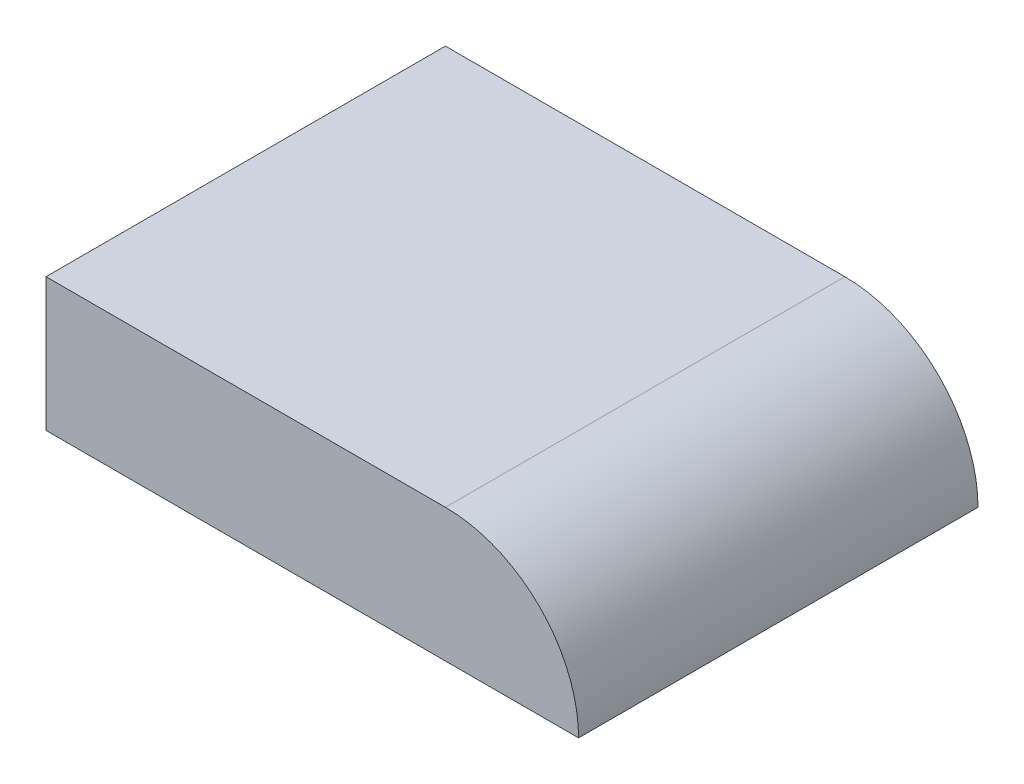
ISO-10303-21;
HEADER;
FILE_DESCRIPTION(('STEP AP214'),'2;1');
FILE_NAME('part.step','',(''),(''),'','','');
FILE_SCHEMA(('AUTOMOTIVE_DESIGN { 1 0 10303 214 1 1 1 1 }'));
ENDSEC;
DATA;
#1=APPLICATION_CONTEXT('core data for automotive mechanical design processes');
#2=APPLICATION_PROTOCOL_DEFINITION('international standard','automotive_design',2000,#1);
#3=PRODUCT_CONTEXT('',#1,'mechanical');
#4=PRODUCT('Part','Part','',(#3));
#5=PRODUCT_RELATED_PRODUCT_CATEGORY('part','',(#4));
#6=PRODUCT_DEFINITION_FORMATION('','',#4);
#7=PRODUCT_DEFINITION_CONTEXT('part definition',#1,'design');
#8=PRODUCT_DEFINITION('design','',#6,#7);
#9=PRODUCT_DEFINITION_SHAPE('','',#8);
#10=(LENGTH_UNIT() NAMED_UNIT(*) SI_UNIT(.MILLI.,.METRE.));
#11=(NAMED_UNIT(*) PLANE_ANGLE_UNIT() SI_UNIT($,.RADIAN.));
#12=(NAMED_UNIT(*) SI_UNIT($,.STERADIAN.) SOLID_ANGLE_UNIT());
#13=UNCERTAINTY_MEASURE_WITH_UNIT(LENGTH_MEASURE(1.E-05),#10,'distance_accuracy_value','');
#14=(GEOMETRIC_REPRESENTATION_CONTEXT(3) GLOBAL_UNCERTAINTY_ASSIGNED_CONTEXT((#13)) GLOBAL_UNIT_ASSIGNED_CONTEXT((#10,
#11,#12)) REPRESENTATION_CONTEXT('',''));
#15=CARTESIAN_POINT('',(0.,0.,0.));
#16=DIRECTION('',(0.,0.,1.));
#17=DIRECTION('',(1.,0.,0.));
#18=AXIS2_PLACEMENT_3D('',#15,#16,#17);
#19=CARTESIAN_POINT('',(-40.2841702897337,44.9264361078546,7.62));
#20=DIRECTION('',(-1.,0.,0.));
#21=DIRECTION('',(0.,0.,1.));
#22=AXIS2_PLACEMENT_3D('',#19,#20,#21);
#23=PLANE('',#22);
#24=DIRECTION('',(0.,1.,0.));
#25=VECTOR('',#24,1.);
#26=CARTESIAN_POINT('',(-40.2841702897337,44.9264361078546,0.));
#27=LINE('',#26,#25);
#28=CARTESIAN_POINT('',(-40.2841702897337,44.9264361078546,0.));
#29=VERTEX_POINT('',#28);
#30=CARTESIAN_POINT('',(-40.2841702897337,47.4664361078546,0.));
#31=VERTEX_POINT('',#30);
#32=EDGE_CURVE('E98',#29,#31,#27,.T.);
#33=ORIENTED_EDGE('',*,*,#32,.F.);
#34=DIRECTION('',(0.,0.,-1.));
#35=VECTOR('',#34,1.);
#36=CARTESIAN_POINT('',(-40.2841702897337,44.9264361078546,7.62));
#37=LINE('',#36,#35);
#38=CARTESIAN_POINT('',(-40.2841702897337,44.9264361078546,7.62));
#39=VERTEX_POINT('',#38);
#40=EDGE_CURVE('E11',#39,#29,#37,.T.);
#41=ORIENTED_EDGE('',*,*,#40,.F.);
#42=DIRECTION('',(0.,1.,0.));
#43=VECTOR('',#42,1.);
#44=CARTESIAN_POINT('',(-40.2841702897337,44.9264361078546,7.62));
#45=LINE('',#44,#43);
#46=CARTESIAN_POINT('',(-40.2841702897337,47.4664361078546,7.62));
#47=VERTEX_POINT('',#46);
#48=EDGE_CURVE('E92',#39,#47,#45,.T.);
#49=ORIENTED_EDGE('',*,*,#48,.T.);
#50=DIRECTION('',(0.,0.,-1.));
#51=VECTOR('',#50,1.);
#52=CARTESIAN_POINT('',(-40.2841702897337,47.4664361078546,7.62));
#53=LINE('',#52,#51);
#54=EDGE_CURVE('E36',#47,#31,#53,.T.);
#55=ORIENTED_EDGE('',*,*,#54,.T.);
#56=EDGE_LOOP('',(#33,#41,#49,#55));
#57=FACE_BOUND('',#56,.T.);
#58=ADVANCED_FACE('F33',(#57),#23,.T.);
#59=CARTESIAN_POINT('',(-40.2841702897337,44.9264361078546,7.62));
#60=DIRECTION('',(0.,1.,0.));
#61=DIRECTION('',(0.,0.,1.));
#62=AXIS2_PLACEMENT_3D('',#59,#60,#61);
#63=PLANE('',#62);
#64=DIRECTION('',(1.,0.,0.));
#65=VECTOR('',#64,1.);
#66=CARTESIAN_POINT('',(-40.2841702897337,44.9264361078546,0.));
#67=LINE('',#66,#65);
#68=CARTESIAN_POINT('',(-30.1241702897337,44.9264361078546,0.));
#69=VERTEX_POINT('',#68);
#70=EDGE_CURVE('E94',#29,#69,#67,.T.);
#71=ORIENTED_EDGE('',*,*,#70,.T.);
#72=DIRECTION('',(0.,0.,-1.));
#73=VECTOR('',#72,1.);
#74=CARTESIAN_POINT('',(-30.1241702897337,44.9264361078546,7.62));
#75=LINE('',#74,#73);
#76=CARTESIAN_POINT('',(-30.1241702897337,44.9264361078546,7.62));
#77=VERTEX_POINT('',#76);
#78=EDGE_CURVE('E42',#77,#69,#75,.T.);
#79=ORIENTED_EDGE('',*,*,#78,.F.);
#80=DIRECTION('',(1.,0.,0.));
#81=VECTOR('',#80,1.);
#82=CARTESIAN_POINT('',(-40.2841702897337,44.9264361078546,7.62));
#83=LINE('',#82,#81);
#84=EDGE_CURVE('E89',#39,#77,#83,.T.);
#85=ORIENTED_EDGE('',*,*,#84,.F.);
#86=ORIENTED_EDGE('',*,*,#40,.T.);
#87=EDGE_LOOP('',(#71,#79,#85,#86));
#88=FACE_BOUND('',#87,.T.);
#89=ADVANCED_FACE('F105',(#88),#63,.F.);
#90=CARTESIAN_POINT('',(-32.6641702897337,44.9264361078546,7.62));
#91=DIRECTION('',(0.,0.,-1.));
#92=DIRECTION('',(-1.,0.,0.));
#93=AXIS2_PLACEMENT_3D('',#90,#91,#92);
#94=CYLINDRICAL_SURFACE('',#93,2.54);
#95=CARTESIAN_POINT('',(-32.6641702897337,44.9264361078546,0.));
#96=DIRECTION('',(0.,0.,-1.));
#97=DIRECTION('',(-1.,0.,0.));
#98=AXIS2_PLACEMENT_3D('',#95,#96,#97);
#99=CIRCLE('',#98,2.54);
#100=CARTESIAN_POINT('',(-32.6641702897337,47.4664361078546,0.));
#101=VERTEX_POINT('',#100);
#102=EDGE_CURVE('E83',#101,#69,#99,.T.);
#103=ORIENTED_EDGE('',*,*,#102,.F.);
#104=DIRECTION('',(0.,0.,-1.));
#105=VECTOR('',#104,1.);
#106=CARTESIAN_POINT('',(-32.6641702897337,47.4664361078546,7.62));
#107=LINE('',#106,#105);
#108=CARTESIAN_POINT('',(-32.6641702897337,47.4664361078546,7.62));
#109=VERTEX_POINT('',#108);
#110=EDGE_CURVE('E78',#109,#101,#107,.T.);
#111=ORIENTED_EDGE('',*,*,#110,.F.);
#112=CARTESIAN_POINT('',(-32.6641702897337,44.9264361078546,7.62));
#113=DIRECTION('',(0.,0.,-1.));
#114=DIRECTION('',(-1.,0.,0.));
#115=AXIS2_PLACEMENT_3D('',#112,#113,#114);
#116=CIRCLE('',#115,2.54);
#117=EDGE_CURVE('E81',#109,#77,#116,.T.);
#118=ORIENTED_EDGE('',*,*,#117,.T.);
#119=ORIENTED_EDGE('',*,*,#78,.T.);
#120=EDGE_LOOP('',(#103,#111,#118,#119));
#121=FACE_BOUND('',#120,.T.);
#122=ADVANCED_FACE('F80',(#121),#94,.T.);
#123=CARTESIAN_POINT('',(-40.2841702897337,47.4664361078546,7.62));
#124=DIRECTION('',(0.,1.,0.));
#125=DIRECTION('',(0.,0.,1.));
#126=AXIS2_PLACEMENT_3D('',#123,#124,#125);
#127=PLANE('',#126);
#128=DIRECTION('',(1.,0.,0.));
#129=VECTOR('',#128,1.);
#130=CARTESIAN_POINT('',(-40.2841702897337,47.4664361078546,0.));
#131=LINE('',#130,#129);
#132=EDGE_CURVE('E101',#31,#101,#131,.T.);
#133=ORIENTED_EDGE('',*,*,#132,.F.);
#134=ORIENTED_EDGE('',*,*,#54,.F.);
#135=DIRECTION('',(1.,0.,0.));
#136=VECTOR('',#135,1.);
#137=CARTESIAN_POINT('',(-40.2841702897337,47.4664361078546,7.62));
#138=LINE('',#137,#136);
#139=EDGE_CURVE('E88',#47,#109,#138,.T.);
#140=ORIENTED_EDGE('',*,*,#139,.T.);
#141=ORIENTED_EDGE('',*,*,#110,.T.);
#142=EDGE_LOOP('',(#133,#134,#140,#141));
#143=FACE_BOUND('',#142,.T.);
#144=ADVANCED_FACE('F91',(#143),#127,.T.);
#145=CARTESIAN_POINT('',(-32.6641702897337,44.9264361078546,7.62));
#146=DIRECTION('',(0.,0.,-1.));
#147=DIRECTION('',(-1.,0.,0.));
#148=AXIS2_PLACEMENT_3D('',#145,#146,#147);
#149=PLANE('',#148);
#150=ORIENTED_EDGE('',*,*,#48,.F.);
#151=ORIENTED_EDGE('',*,*,#84,.T.);
#152=ORIENTED_EDGE('',*,*,#117,.F.);
#153=ORIENTED_EDGE('',*,*,#139,.F.);
#154=EDGE_LOOP('',(#150,#151,#152,#153));
#155=FACE_BOUND('',#154,.T.);
#156=ADVANCED_FACE('F87',(#155),#149,.F.);
#157=CARTESIAN_POINT('',(-32.6641702897337,44.9264361078546,0.));
#158=DIRECTION('',(0.,0.,-1.));
#159=DIRECTION('',(-1.,0.,0.));
#160=AXIS2_PLACEMENT_3D('',#157,#158,#159);
#161=PLANE('',#160);
#162=ORIENTED_EDGE('',*,*,#32,.T.);
#163=ORIENTED_EDGE('',*,*,#132,.T.);
#164=ORIENTED_EDGE('',*,*,#102,.T.);
#165=ORIENTED_EDGE('',*,*,#70,.F.);
#166=EDGE_LOOP('',(#162,#163,#164,#165));
#167=FACE_BOUND('',#166,.T.);
#168=ADVANCED_FACE('F107',(#167),#161,.T.);
#169=CLOSED_SHELL('',(#58,#89,#122,#144,#156,#168));
#170=MANIFOLD_SOLID_BREP('B2',#169);
#171=ADVANCED_BREP_SHAPE_REPRESENTATION('',(#18,#170),#14);
#172=SHAPE_DEFINITION_REPRESENTATION(#9,#171);
ENDSEC;
END-ISO-10303-21;
